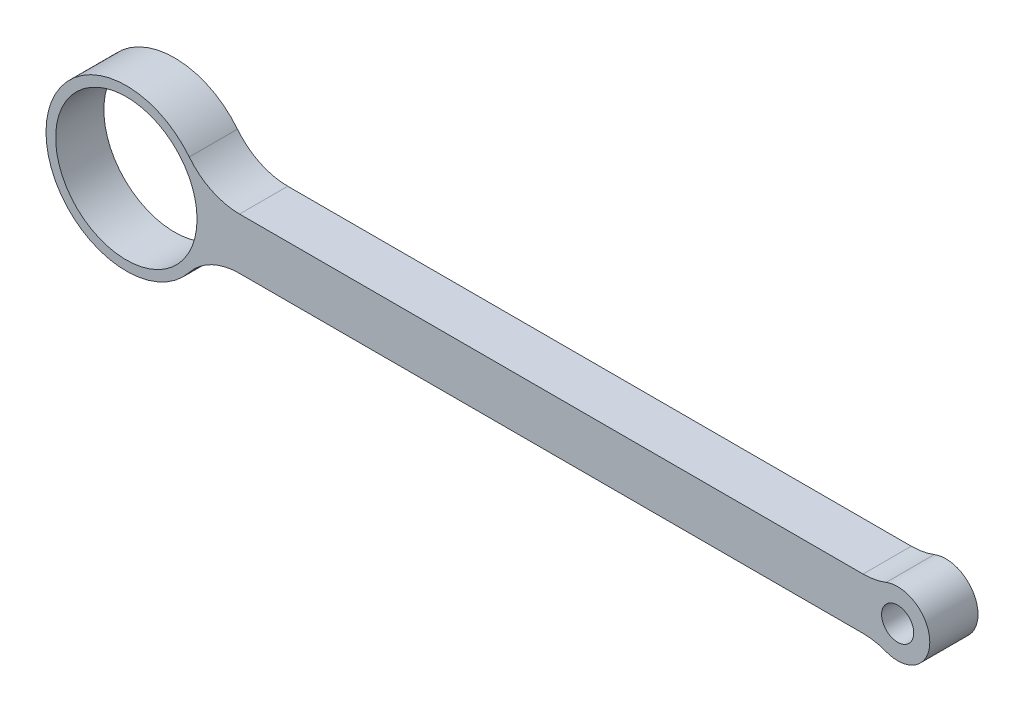
ISO-10303-21;
HEADER;
FILE_DESCRIPTION(('STEP AP214'),'2;1');
FILE_NAME('part.step','',(''),(''),'','','');
FILE_SCHEMA(('AUTOMOTIVE_DESIGN { 1 0 10303 214 1 1 1 1 }'));
ENDSEC;
DATA;
#1=APPLICATION_CONTEXT('core data for automotive mechanical design processes');
#2=APPLICATION_PROTOCOL_DEFINITION('international standard','automotive_design',2000,#1);
#3=PRODUCT_CONTEXT('',#1,'mechanical');
#4=PRODUCT('Part','Part','',(#3));
#5=PRODUCT_RELATED_PRODUCT_CATEGORY('part','',(#4));
#6=PRODUCT_DEFINITION_FORMATION('','',#4);
#7=PRODUCT_DEFINITION_CONTEXT('part definition',#1,'design');
#8=PRODUCT_DEFINITION('design','',#6,#7);
#9=PRODUCT_DEFINITION_SHAPE('','',#8);
#10=(LENGTH_UNIT() NAMED_UNIT(*) SI_UNIT(.MILLI.,.METRE.));
#11=(NAMED_UNIT(*) PLANE_ANGLE_UNIT() SI_UNIT($,.RADIAN.));
#12=(NAMED_UNIT(*) SI_UNIT($,.STERADIAN.) SOLID_ANGLE_UNIT());
#13=UNCERTAINTY_MEASURE_WITH_UNIT(LENGTH_MEASURE(1.E-05),#10,'distance_accuracy_value','');
#14=(GEOMETRIC_REPRESENTATION_CONTEXT(3) GLOBAL_UNCERTAINTY_ASSIGNED_CONTEXT((#13)) GLOBAL_UNIT_ASSIGNED_CONTEXT((#10,
#11,#12)) REPRESENTATION_CONTEXT('',''));
#15=CARTESIAN_POINT('',(0.,0.,0.));
#16=DIRECTION('',(0.,0.,1.));
#17=DIRECTION('',(1.,0.,0.));
#18=AXIS2_PLACEMENT_3D('',#15,#16,#17);
#19=CARTESIAN_POINT('',(0.,3.99999999999999,7.5));
#20=DIRECTION('',(0.,-1.,0.));
#21=DIRECTION('',(1.,0.,0.));
#22=AXIS2_PLACEMENT_3D('',#19,#20,#21);
#23=PLANE('',#22);
#24=DIRECTION('',(-1.,0.,0.));
#25=VECTOR('',#24,1.);
#26=CARTESIAN_POINT('',(0.,3.99999999999999,7.5));
#27=LINE('',#26,#25);
#28=CARTESIAN_POINT('',(54.6148351928655,3.99999999999998,7.5));
#29=VERTEX_POINT('',#28);
#30=CARTESIAN_POINT('',(-42.3860850461915,3.99999999999999,7.5));
#31=VERTEX_POINT('',#30);
#32=EDGE_CURVE('E119',#29,#31,#27,.T.);
#33=ORIENTED_EDGE('',*,*,#32,.F.);
#34=DIRECTION('',(0.,0.,-1.));
#35=VECTOR('',#34,1.);
#36=CARTESIAN_POINT('',(54.6148351928655,3.99999999999998,7.5));
#37=LINE('',#36,#35);
#38=CARTESIAN_POINT('',(54.6148351928655,3.99999999999998,0.));
#39=VERTEX_POINT('',#38);
#40=EDGE_CURVE('E106',#29,#39,#37,.T.);
#41=ORIENTED_EDGE('',*,*,#40,.T.);
#42=DIRECTION('',(-1.,0.,0.));
#43=VECTOR('',#42,1.);
#44=CARTESIAN_POINT('',(0.,3.99999999999999,0.));
#45=LINE('',#44,#43);
#46=CARTESIAN_POINT('',(-42.3860850461915,3.99999999999999,0.));
#47=VERTEX_POINT('',#46);
#48=EDGE_CURVE('E117',#39,#47,#45,.T.);
#49=ORIENTED_EDGE('',*,*,#48,.T.);
#50=DIRECTION('',(0.,0.,1.));
#51=VECTOR('',#50,1.);
#52=CARTESIAN_POINT('',(-42.3860850461915,3.99999999999999,7.5));
#53=LINE('',#52,#51);
#54=EDGE_CURVE('E121',#47,#31,#53,.T.);
#55=ORIENTED_EDGE('',*,*,#54,.T.);
#56=EDGE_LOOP('',(#33,#41,#49,#55));
#57=FACE_BOUND('',#56,.T.);
#58=ADVANCED_FACE('F37',(#57),#23,.F.);
#59=CARTESIAN_POINT('',(-60.,0.,7.5));
#60=DIRECTION('',(0.,0.,-1.));
#61=DIRECTION('',(-1.,0.,0.));
#62=AXIS2_PLACEMENT_3D('',#59,#60,#61);
#63=CYLINDRICAL_SURFACE('',#62,12.5);
#64=CARTESIAN_POINT('',(-60.,0.,0.));
#65=DIRECTION('',(0.,0.,1.));
#66=DIRECTION('',(1.,0.,0.));
#67=AXIS2_PLACEMENT_3D('',#64,#65,#66);
#68=CIRCLE('',#67,12.5);
#69=CARTESIAN_POINT('',(-50.2144916923286,7.77777777777777,0.));
#70=VERTEX_POINT('',#69);
#71=CARTESIAN_POINT('',(-50.2144916923286,-7.77777777777779,0.));
#72=VERTEX_POINT('',#71);
#73=EDGE_CURVE('E125',#70,#72,#68,.T.);
#74=ORIENTED_EDGE('',*,*,#73,.T.);
#75=DIRECTION('',(0.,0.,-1.));
#76=VECTOR('',#75,1.);
#77=CARTESIAN_POINT('',(-50.2144916923286,-7.77777777777779,7.5));
#78=LINE('',#77,#76);
#79=CARTESIAN_POINT('',(-50.2144916923286,-7.77777777777779,7.5));
#80=VERTEX_POINT('',#79);
#81=EDGE_CURVE('E52',#72,#80,#78,.F.);
#82=ORIENTED_EDGE('',*,*,#81,.T.);
#83=CARTESIAN_POINT('',(-60.,0.,7.5));
#84=DIRECTION('',(0.,0.,1.));
#85=DIRECTION('',(1.,0.,0.));
#86=AXIS2_PLACEMENT_3D('',#83,#84,#85);
#87=CIRCLE('',#86,12.5);
#88=CARTESIAN_POINT('',(-50.2144916923286,7.77777777777777,7.5));
#89=VERTEX_POINT('',#88);
#90=EDGE_CURVE('E169',#89,#80,#87,.T.);
#91=ORIENTED_EDGE('',*,*,#90,.F.);
#92=DIRECTION('',(0.,0.,-1.));
#93=VECTOR('',#92,1.);
#94=CARTESIAN_POINT('',(-50.2144916923286,7.77777777777777,7.5));
#95=LINE('',#94,#93);
#96=EDGE_CURVE('E150',#89,#70,#95,.T.);
#97=ORIENTED_EDGE('',*,*,#96,.T.);
#98=EDGE_LOOP('',(#74,#82,#91,#97));
#99=FACE_BOUND('',#98,.T.);
#100=ADVANCED_FACE('F178',(#99),#63,.T.);
#101=CARTESIAN_POINT('',(0.,-3.99999999999999,7.5));
#102=DIRECTION('',(0.,-1.,0.));
#103=DIRECTION('',(1.,0.,0.));
#104=AXIS2_PLACEMENT_3D('',#101,#102,#103);
#105=PLANE('',#104);
#106=DIRECTION('',(-1.,0.,0.));
#107=VECTOR('',#106,1.);
#108=CARTESIAN_POINT('',(0.,-3.99999999999999,0.));
#109=LINE('',#108,#107);
#110=CARTESIAN_POINT('',(54.6148351928654,-3.99999999999997,0.));
#111=VERTEX_POINT('',#110);
#112=CARTESIAN_POINT('',(-42.3860850461915,-4.00000000000001,0.));
#113=VERTEX_POINT('',#112);
#114=EDGE_CURVE('E128',#111,#113,#109,.T.);
#115=ORIENTED_EDGE('',*,*,#114,.F.);
#116=DIRECTION('',(0.,0.,1.));
#117=VECTOR('',#116,1.);
#118=CARTESIAN_POINT('',(54.6148351928654,-3.99999999999997,7.5));
#119=LINE('',#118,#117);
#120=CARTESIAN_POINT('',(54.6148351928654,-3.99999999999997,7.5));
#121=VERTEX_POINT('',#120);
#122=EDGE_CURVE('E148',#111,#121,#119,.T.);
#123=ORIENTED_EDGE('',*,*,#122,.T.);
#124=DIRECTION('',(-1.,0.,0.));
#125=VECTOR('',#124,1.);
#126=CARTESIAN_POINT('',(0.,-3.99999999999999,7.5));
#127=LINE('',#126,#125);
#128=CARTESIAN_POINT('',(-42.3860850461915,-4.00000000000001,7.5));
#129=VERTEX_POINT('',#128);
#130=EDGE_CURVE('E167',#121,#129,#127,.T.);
#131=ORIENTED_EDGE('',*,*,#130,.T.);
#132=DIRECTION('',(0.,0.,-1.));
#133=VECTOR('',#132,1.);
#134=CARTESIAN_POINT('',(-42.3860850461915,-4.00000000000001,7.5));
#135=LINE('',#134,#133);
#136=EDGE_CURVE('E145',#129,#113,#135,.T.);
#137=ORIENTED_EDGE('',*,*,#136,.T.);
#138=EDGE_LOOP('',(#115,#123,#131,#137));
#139=FACE_BOUND('',#138,.T.);
#140=ADVANCED_FACE('F174',(#139),#105,.T.);
#141=CARTESIAN_POINT('',(60.,0.,7.5));
#142=DIRECTION('',(0.,0.,-1.));
#143=DIRECTION('',(-1.,0.,0.));
#144=AXIS2_PLACEMENT_3D('',#141,#142,#143);
#145=CYLINDRICAL_SURFACE('',#144,2.5);
#146=CARTESIAN_POINT('',(60.,0.,7.5));
#147=DIRECTION('',(0.,0.,1.));
#148=DIRECTION('',(1.,0.,0.));
#149=AXIS2_PLACEMENT_3D('',#146,#147,#148);
#150=CIRCLE('',#149,2.5);
#151=CARTESIAN_POINT('',(62.5,0.,7.5));
#152=VERTEX_POINT('',#151);
#153=EDGE_CURVE('E181',#152,#152,#150,.T.);
#154=ORIENTED_EDGE('',*,*,#153,.T.);
#155=EDGE_LOOP('',(#154));
#156=FACE_BOUND('',#155,.T.);
#157=CARTESIAN_POINT('',(60.,0.,0.));
#158=DIRECTION('',(0.,0.,1.));
#159=DIRECTION('',(1.,0.,0.));
#160=AXIS2_PLACEMENT_3D('',#157,#158,#159);
#161=CIRCLE('',#160,2.5);
#162=CARTESIAN_POINT('',(62.5,0.,0.));
#163=VERTEX_POINT('',#162);
#164=EDGE_CURVE('E126',#163,#163,#161,.T.);
#165=ORIENTED_EDGE('',*,*,#164,.F.);
#166=EDGE_LOOP('',(#165));
#167=FACE_BOUND('',#166,.T.);
#168=ADVANCED_FACE('F197',(#156,#167),#145,.F.);
#169=CARTESIAN_POINT('',(-60.,0.,7.5));
#170=DIRECTION('',(0.,0.,-1.));
#171=DIRECTION('',(-1.,0.,0.));
#172=AXIS2_PLACEMENT_3D('',#169,#170,#171);
#173=CYLINDRICAL_SURFACE('',#172,11.);
#174=CARTESIAN_POINT('',(-60.,0.,7.5));
#175=DIRECTION('',(0.,0.,1.));
#176=DIRECTION('',(1.,0.,0.));
#177=AXIS2_PLACEMENT_3D('',#174,#175,#176);
#178=CIRCLE('',#177,11.);
#179=CARTESIAN_POINT('',(-49.,0.,7.5));
#180=VERTEX_POINT('',#179);
#181=EDGE_CURVE('E139',#180,#180,#178,.T.);
#182=ORIENTED_EDGE('',*,*,#181,.T.);
#183=EDGE_LOOP('',(#182));
#184=FACE_BOUND('',#183,.T.);
#185=CARTESIAN_POINT('',(-60.,0.,0.));
#186=DIRECTION('',(0.,0.,1.));
#187=DIRECTION('',(1.,0.,0.));
#188=AXIS2_PLACEMENT_3D('',#185,#186,#187);
#189=CIRCLE('',#188,11.);
#190=CARTESIAN_POINT('',(-49.,0.,0.));
#191=VERTEX_POINT('',#190);
#192=EDGE_CURVE('E131',#191,#191,#189,.T.);
#193=ORIENTED_EDGE('',*,*,#192,.F.);
#194=EDGE_LOOP('',(#193));
#195=FACE_BOUND('',#194,.T.);
#196=ADVANCED_FACE('F194',(#184,#195),#173,.F.);
#197=CARTESIAN_POINT('',(60.,0.,7.5));
#198=DIRECTION('',(0.,0.,-1.));
#199=DIRECTION('',(-1.,0.,0.));
#200=AXIS2_PLACEMENT_3D('',#197,#198,#199);
#201=CYLINDRICAL_SURFACE('',#200,4.99999999999999);
#202=CARTESIAN_POINT('',(60.,0.,0.));
#203=DIRECTION('',(0.,0.,1.));
#204=DIRECTION('',(1.,0.,0.));
#205=AXIS2_PLACEMENT_3D('',#202,#203,#204);
#206=CIRCLE('',#205,4.99999999999999);
#207=CARTESIAN_POINT('',(58.2049450642885,4.66666666666665,0.));
#208=VERTEX_POINT('',#207);
#209=CARTESIAN_POINT('',(58.2049450642885,-4.66666666666665,0.));
#210=VERTEX_POINT('',#209);
#211=EDGE_CURVE('E137',#208,#210,#206,.F.);
#212=ORIENTED_EDGE('',*,*,#211,.F.);
#213=DIRECTION('',(0.,0.,-1.));
#214=VECTOR('',#213,1.);
#215=CARTESIAN_POINT('',(58.2049450642885,4.66666666666665,7.5));
#216=LINE('',#215,#214);
#217=CARTESIAN_POINT('',(58.2049450642885,4.66666666666665,7.5));
#218=VERTEX_POINT('',#217);
#219=EDGE_CURVE('E107',#208,#218,#216,.F.);
#220=ORIENTED_EDGE('',*,*,#219,.T.);
#221=CARTESIAN_POINT('',(60.,0.,7.5));
#222=DIRECTION('',(0.,0.,1.));
#223=DIRECTION('',(1.,0.,0.));
#224=AXIS2_PLACEMENT_3D('',#221,#222,#223);
#225=CIRCLE('',#224,4.99999999999999);
#226=CARTESIAN_POINT('',(58.2049450642885,-4.66666666666665,7.5));
#227=VERTEX_POINT('',#226);
#228=EDGE_CURVE('E140',#218,#227,#225,.F.);
#229=ORIENTED_EDGE('',*,*,#228,.T.);
#230=DIRECTION('',(0.,0.,-1.));
#231=VECTOR('',#230,1.);
#232=CARTESIAN_POINT('',(58.2049450642885,-4.66666666666666,7.5));
#233=LINE('',#232,#231);
#234=EDGE_CURVE('E120',#227,#210,#233,.T.);
#235=ORIENTED_EDGE('',*,*,#234,.T.);
#236=EDGE_LOOP('',(#212,#220,#229,#235));
#237=FACE_BOUND('',#236,.T.);
#238=ADVANCED_FACE('F196',(#237),#201,.T.);
#239=CARTESIAN_POINT('',(0.,0.,7.5));
#240=DIRECTION('',(0.,0.,1.));
#241=DIRECTION('',(1.,0.,0.));
#242=AXIS2_PLACEMENT_3D('',#239,#240,#241);
#243=PLANE('',#242);
#244=ORIENTED_EDGE('',*,*,#181,.F.);
#245=EDGE_LOOP('',(#244));
#246=FACE_BOUND('',#245,.T.);
#247=ORIENTED_EDGE('',*,*,#153,.F.);
#248=EDGE_LOOP('',(#247));
#249=FACE_BOUND('',#248,.T.);
#250=ORIENTED_EDGE('',*,*,#228,.F.);
#251=CARTESIAN_POINT('',(54.6148351928655,14.,7.5));
#252=DIRECTION('',(0.,0.,1.));
#253=DIRECTION('',(1.,0.,0.));
#254=AXIS2_PLACEMENT_3D('',#251,#252,#253);
#255=CIRCLE('',#254,10.);
#256=EDGE_CURVE('E112',#218,#29,#255,.F.);
#257=ORIENTED_EDGE('',*,*,#256,.T.);
#258=ORIENTED_EDGE('',*,*,#32,.T.);
#259=CARTESIAN_POINT('',(-42.3860850461915,14.,7.5));
#260=DIRECTION('',(0.,0.,1.));
#261=DIRECTION('',(1.,0.,0.));
#262=AXIS2_PLACEMENT_3D('',#259,#260,#261);
#263=CIRCLE('',#262,10.);
#264=EDGE_CURVE('E11',#31,#89,#263,.F.);
#265=ORIENTED_EDGE('',*,*,#264,.T.);
#266=ORIENTED_EDGE('',*,*,#90,.T.);
#267=CARTESIAN_POINT('',(-42.3860850461915,-14.,7.5));
#268=DIRECTION('',(0.,0.,1.));
#269=DIRECTION('',(1.,0.,0.));
#270=AXIS2_PLACEMENT_3D('',#267,#268,#269);
#271=CIRCLE('',#270,10.);
#272=EDGE_CURVE('E161',#80,#129,#271,.F.);
#273=ORIENTED_EDGE('',*,*,#272,.T.);
#274=ORIENTED_EDGE('',*,*,#130,.F.);
#275=CARTESIAN_POINT('',(54.6148351928654,-14.,7.5));
#276=DIRECTION('',(0.,0.,1.));
#277=DIRECTION('',(1.,0.,0.));
#278=AXIS2_PLACEMENT_3D('',#275,#276,#277);
#279=CIRCLE('',#278,10.);
#280=EDGE_CURVE('E157',#121,#227,#279,.F.);
#281=ORIENTED_EDGE('',*,*,#280,.T.);
#282=EDGE_LOOP('',(#250,#257,#258,#265,#266,#273,#274,#281));
#283=FACE_BOUND('',#282,.T.);
#284=ADVANCED_FACE('F166',(#246,#249,#283),#243,.T.);
#285=CARTESIAN_POINT('',(0.,0.,0.));
#286=DIRECTION('',(0.,0.,1.));
#287=DIRECTION('',(1.,0.,0.));
#288=AXIS2_PLACEMENT_3D('',#285,#286,#287);
#289=PLANE('',#288);
#290=ORIENTED_EDGE('',*,*,#192,.T.);
#291=EDGE_LOOP('',(#290));
#292=FACE_BOUND('',#291,.T.);
#293=ORIENTED_EDGE('',*,*,#164,.T.);
#294=EDGE_LOOP('',(#293));
#295=FACE_BOUND('',#294,.T.);
#296=ORIENTED_EDGE('',*,*,#48,.F.);
#297=CARTESIAN_POINT('',(54.6148351928655,14.,0.));
#298=DIRECTION('',(0.,0.,1.));
#299=DIRECTION('',(1.,0.,0.));
#300=AXIS2_PLACEMENT_3D('',#297,#298,#299);
#301=CIRCLE('',#300,10.);
#302=EDGE_CURVE('E102',#39,#208,#301,.T.);
#303=ORIENTED_EDGE('',*,*,#302,.T.);
#304=ORIENTED_EDGE('',*,*,#211,.T.);
#305=CARTESIAN_POINT('',(54.6148351928654,-14.,0.));
#306=DIRECTION('',(0.,0.,1.));
#307=DIRECTION('',(1.,0.,0.));
#308=AXIS2_PLACEMENT_3D('',#305,#306,#307);
#309=CIRCLE('',#308,10.);
#310=EDGE_CURVE('E155',#210,#111,#309,.T.);
#311=ORIENTED_EDGE('',*,*,#310,.T.);
#312=ORIENTED_EDGE('',*,*,#114,.T.);
#313=CARTESIAN_POINT('',(-42.3860850461915,-14.,0.));
#314=DIRECTION('',(0.,0.,1.));
#315=DIRECTION('',(1.,0.,0.));
#316=AXIS2_PLACEMENT_3D('',#313,#314,#315);
#317=CIRCLE('',#316,10.);
#318=EDGE_CURVE('E159',#113,#72,#317,.T.);
#319=ORIENTED_EDGE('',*,*,#318,.T.);
#320=ORIENTED_EDGE('',*,*,#73,.F.);
#321=CARTESIAN_POINT('',(-42.3860850461915,14.,0.));
#322=DIRECTION('',(0.,0.,1.));
#323=DIRECTION('',(1.,0.,0.));
#324=AXIS2_PLACEMENT_3D('',#321,#322,#323);
#325=CIRCLE('',#324,10.);
#326=EDGE_CURVE('E45',#70,#47,#325,.T.);
#327=ORIENTED_EDGE('',*,*,#326,.T.);
#328=EDGE_LOOP('',(#296,#303,#304,#311,#312,#319,#320,#327));
#329=FACE_BOUND('',#328,.T.);
#330=ADVANCED_FACE('F123',(#292,#295,#329),#289,.F.);
#331=CARTESIAN_POINT('',(54.6148351928655,14.,7.5));
#332=DIRECTION('',(0.,0.,-1.));
#333=DIRECTION('',(-1.,0.,0.));
#334=AXIS2_PLACEMENT_3D('',#331,#332,#333);
#335=CYLINDRICAL_SURFACE('',#334,10.);
#336=ORIENTED_EDGE('',*,*,#256,.F.);
#337=ORIENTED_EDGE('',*,*,#219,.F.);
#338=ORIENTED_EDGE('',*,*,#302,.F.);
#339=ORIENTED_EDGE('',*,*,#40,.F.);
#340=EDGE_LOOP('',(#336,#337,#338,#339));
#341=FACE_BOUND('',#340,.T.);
#342=ADVANCED_FACE('F105',(#341),#335,.F.);
#343=CARTESIAN_POINT('',(54.6148351928654,-14.,7.5));
#344=DIRECTION('',(0.,0.,-1.));
#345=DIRECTION('',(-1.,0.,0.));
#346=AXIS2_PLACEMENT_3D('',#343,#344,#345);
#347=CYLINDRICAL_SURFACE('',#346,10.);
#348=ORIENTED_EDGE('',*,*,#280,.F.);
#349=ORIENTED_EDGE('',*,*,#122,.F.);
#350=ORIENTED_EDGE('',*,*,#310,.F.);
#351=ORIENTED_EDGE('',*,*,#234,.F.);
#352=EDGE_LOOP('',(#348,#349,#350,#351));
#353=FACE_BOUND('',#352,.T.);
#354=ADVANCED_FACE('F242',(#353),#347,.F.);
#355=CARTESIAN_POINT('',(-42.3860850461915,-14.,7.5));
#356=DIRECTION('',(0.,0.,-1.));
#357=DIRECTION('',(-1.,0.,0.));
#358=AXIS2_PLACEMENT_3D('',#355,#356,#357);
#359=CYLINDRICAL_SURFACE('',#358,10.);
#360=ORIENTED_EDGE('',*,*,#272,.F.);
#361=ORIENTED_EDGE('',*,*,#81,.F.);
#362=ORIENTED_EDGE('',*,*,#318,.F.);
#363=ORIENTED_EDGE('',*,*,#136,.F.);
#364=EDGE_LOOP('',(#360,#361,#362,#363));
#365=FACE_BOUND('',#364,.T.);
#366=ADVANCED_FACE('F177',(#365),#359,.F.);
#367=CARTESIAN_POINT('',(-42.3860850461915,14.,7.5));
#368=DIRECTION('',(0.,0.,-1.));
#369=DIRECTION('',(-1.,0.,0.));
#370=AXIS2_PLACEMENT_3D('',#367,#368,#369);
#371=CYLINDRICAL_SURFACE('',#370,10.);
#372=ORIENTED_EDGE('',*,*,#264,.F.);
#373=ORIENTED_EDGE('',*,*,#54,.F.);
#374=ORIENTED_EDGE('',*,*,#326,.F.);
#375=ORIENTED_EDGE('',*,*,#96,.F.);
#376=EDGE_LOOP('',(#372,#373,#374,#375));
#377=FACE_BOUND('',#376,.T.);
#378=ADVANCED_FACE('F39',(#377),#371,.F.);
#379=CLOSED_SHELL('',(#58,#100,#140,#168,#196,#238,#284,#330,#342,#354,#366,#378));
#380=MANIFOLD_SOLID_BREP('B2',#379);
#381=ADVANCED_BREP_SHAPE_REPRESENTATION('',(#18,#380),#14);
#382=SHAPE_DEFINITION_REPRESENTATION(#9,#381);
ENDSEC;
END-ISO-10303-21;
